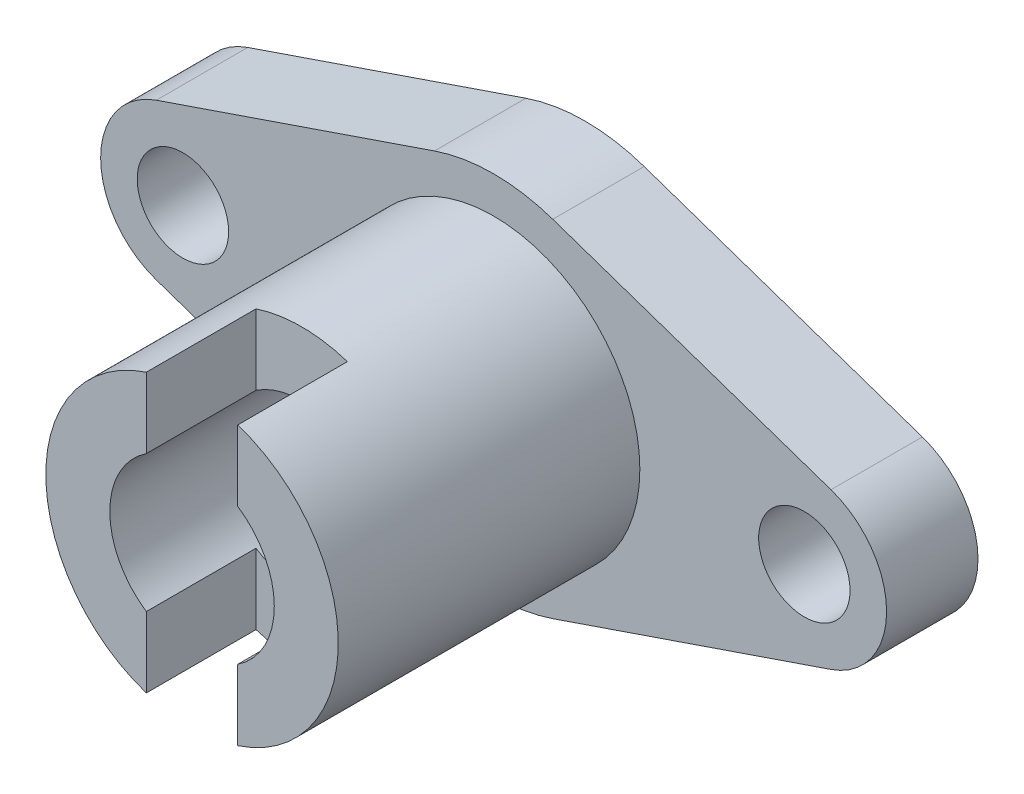
ISO-10303-21;
HEADER;
FILE_DESCRIPTION(('STEP AP214'),'2;1');
FILE_NAME('part.step','',(''),(''),'','','');
FILE_SCHEMA(('AUTOMOTIVE_DESIGN { 1 0 10303 214 1 1 1 1 }'));
ENDSEC;
DATA;
#1=APPLICATION_CONTEXT('core data for automotive mechanical design processes');
#2=APPLICATION_PROTOCOL_DEFINITION('international standard','automotive_design',2000,#1);
#3=PRODUCT_CONTEXT('',#1,'mechanical');
#4=PRODUCT('Part','Part','',(#3));
#5=PRODUCT_RELATED_PRODUCT_CATEGORY('part','',(#4));
#6=PRODUCT_DEFINITION_FORMATION('','',#4);
#7=PRODUCT_DEFINITION_CONTEXT('part definition',#1,'design');
#8=PRODUCT_DEFINITION('design','',#6,#7);
#9=PRODUCT_DEFINITION_SHAPE('','',#8);
#10=(LENGTH_UNIT() NAMED_UNIT(*) SI_UNIT(.MILLI.,.METRE.));
#11=(NAMED_UNIT(*) PLANE_ANGLE_UNIT() SI_UNIT($,.RADIAN.));
#12=(NAMED_UNIT(*) SI_UNIT($,.STERADIAN.) SOLID_ANGLE_UNIT());
#13=UNCERTAINTY_MEASURE_WITH_UNIT(LENGTH_MEASURE(1.E-05),#10,'distance_accuracy_value','');
#14=(GEOMETRIC_REPRESENTATION_CONTEXT(3) GLOBAL_UNCERTAINTY_ASSIGNED_CONTEXT((#13)) GLOBAL_UNIT_ASSIGNED_CONTEXT((#10,
#11,#12)) REPRESENTATION_CONTEXT('',''));
#15=CARTESIAN_POINT('',(0.,0.,0.));
#16=DIRECTION('',(0.,0.,1.));
#17=DIRECTION('',(1.,0.,0.));
#18=AXIS2_PLACEMENT_3D('',#15,#16,#17);
#19=CARTESIAN_POINT('',(0.,0.,43.));
#20=DIRECTION('',(0.,0.,-1.));
#21=DIRECTION('',(-1.,0.,0.));
#22=AXIS2_PLACEMENT_3D('',#19,#20,#21);
#23=CYLINDRICAL_SURFACE('',#22,16.);
#24=CARTESIAN_POINT('',(0.,0.,10.));
#25=DIRECTION('',(0.,0.,1.));
#26=DIRECTION('',(1.,0.,0.));
#27=AXIS2_PLACEMENT_3D('',#24,#25,#26);
#28=CIRCLE('',#27,16.);
#29=CARTESIAN_POINT('',(16.,0.,10.));
#30=VERTEX_POINT('',#29);
#31=EDGE_CURVE('E194',#30,#30,#28,.T.);
#32=ORIENTED_EDGE('',*,*,#31,.T.);
#33=EDGE_LOOP('',(#32));
#34=FACE_BOUND('',#33,.T.);
#35=DIRECTION('',(0.,0.,-1.));
#36=VECTOR('',#35,1.);
#37=CARTESIAN_POINT('',(-5.,15.1986841535707,43.));
#38=LINE('',#37,#36);
#39=CARTESIAN_POINT('',(-5.,15.1986841535707,31.));
#40=VERTEX_POINT('',#39);
#41=CARTESIAN_POINT('',(-5.,15.1986841535707,43.));
#42=VERTEX_POINT('',#41);
#43=EDGE_CURVE('E165',#40,#42,#38,.F.);
#44=ORIENTED_EDGE('',*,*,#43,.F.);
#45=CARTESIAN_POINT('',(0.,0.,31.));
#46=DIRECTION('',(0.,0.,1.));
#47=DIRECTION('',(1.,0.,0.));
#48=AXIS2_PLACEMENT_3D('',#45,#46,#47);
#49=CIRCLE('',#48,16.);
#50=CARTESIAN_POINT('',(5.,15.1986841535707,31.));
#51=VERTEX_POINT('',#50);
#52=EDGE_CURVE('E169',#51,#40,#49,.T.);
#53=ORIENTED_EDGE('',*,*,#52,.F.);
#54=DIRECTION('',(0.,0.,-1.));
#55=VECTOR('',#54,1.);
#56=CARTESIAN_POINT('',(5.,15.1986841535707,43.));
#57=LINE('',#56,#55);
#58=CARTESIAN_POINT('',(5.,15.1986841535707,43.));
#59=VERTEX_POINT('',#58);
#60=EDGE_CURVE('E154',#59,#51,#57,.T.);
#61=ORIENTED_EDGE('',*,*,#60,.F.);
#62=CARTESIAN_POINT('',(0.,0.,43.));
#63=DIRECTION('',(0.,0.,1.));
#64=DIRECTION('',(1.,0.,0.));
#65=AXIS2_PLACEMENT_3D('',#62,#63,#64);
#66=CIRCLE('',#65,16.);
#67=CARTESIAN_POINT('',(5.,-15.1986841535707,43.));
#68=VERTEX_POINT('',#67);
#69=EDGE_CURVE('E195',#68,#59,#66,.T.);
#70=ORIENTED_EDGE('',*,*,#69,.F.);
#71=DIRECTION('',(0.,0.,-1.));
#72=VECTOR('',#71,1.);
#73=CARTESIAN_POINT('',(5.,-15.1986841535707,43.));
#74=LINE('',#73,#72);
#75=CARTESIAN_POINT('',(5.,-15.1986841535707,31.));
#76=VERTEX_POINT('',#75);
#77=EDGE_CURVE('E166',#76,#68,#74,.F.);
#78=ORIENTED_EDGE('',*,*,#77,.F.);
#79=CARTESIAN_POINT('',(-5.,-15.1986841535707,31.));
#80=VERTEX_POINT('',#79);
#81=EDGE_CURVE('E176',#80,#76,#49,.T.);
#82=ORIENTED_EDGE('',*,*,#81,.F.);
#83=DIRECTION('',(0.,0.,-1.));
#84=VECTOR('',#83,1.);
#85=CARTESIAN_POINT('',(-5.,-15.1986841535707,43.));
#86=LINE('',#85,#84);
#87=CARTESIAN_POINT('',(-5.,-15.1986841535707,43.));
#88=VERTEX_POINT('',#87);
#89=EDGE_CURVE('E185',#88,#80,#86,.T.);
#90=ORIENTED_EDGE('',*,*,#89,.F.);
#91=EDGE_CURVE('E197',#42,#88,#66,.T.);
#92=ORIENTED_EDGE('',*,*,#91,.F.);
#93=EDGE_LOOP('',(#44,#53,#61,#70,#78,#82,#90,#92));
#94=FACE_BOUND('',#93,.T.);
#95=ADVANCED_FACE('F42',(#34,#94),#23,.T.);
#96=CARTESIAN_POINT('',(0.,0.,43.));
#97=DIRECTION('',(0.,0.,1.));
#98=DIRECTION('',(1.,0.,0.));
#99=AXIS2_PLACEMENT_3D('',#96,#97,#98);
#100=PLANE('',#99);
#101=ORIENTED_EDGE('',*,*,#91,.T.);
#102=DIRECTION('',(0.,-1.,0.));
#103=VECTOR('',#102,1.);
#104=CARTESIAN_POINT('',(-5.,89.,43.));
#105=LINE('',#104,#103);
#106=CARTESIAN_POINT('',(-5.,-7.48331477354788,43.));
#107=VERTEX_POINT('',#106);
#108=EDGE_CURVE('E181',#107,#88,#105,.T.);
#109=ORIENTED_EDGE('',*,*,#108,.F.);
#110=CARTESIAN_POINT('',(0.,0.,43.));
#111=DIRECTION('',(0.,0.,1.));
#112=DIRECTION('',(1.,0.,0.));
#113=AXIS2_PLACEMENT_3D('',#110,#111,#112);
#114=CIRCLE('',#113,9.);
#115=CARTESIAN_POINT('',(-5.,7.48331477354788,43.));
#116=VERTEX_POINT('',#115);
#117=EDGE_CURVE('E190',#116,#107,#114,.T.);
#118=ORIENTED_EDGE('',*,*,#117,.F.);
#119=EDGE_CURVE('E179',#42,#116,#105,.T.);
#120=ORIENTED_EDGE('',*,*,#119,.F.);
#121=EDGE_LOOP('',(#101,#109,#118,#120));
#122=FACE_BOUND('',#121,.T.);
#123=ADVANCED_FACE('F300',(#122),#100,.T.);
#124=ORIENTED_EDGE('',*,*,#69,.T.);
#125=DIRECTION('',(0.,-1.,0.));
#126=VECTOR('',#125,1.);
#127=CARTESIAN_POINT('',(5.,89.,43.));
#128=LINE('',#127,#126);
#129=CARTESIAN_POINT('',(5.,7.48331477354788,43.));
#130=VERTEX_POINT('',#129);
#131=EDGE_CURVE('E160',#59,#130,#128,.T.);
#132=ORIENTED_EDGE('',*,*,#131,.T.);
#133=CARTESIAN_POINT('',(5.,-7.48331477354788,43.));
#134=VERTEX_POINT('',#133);
#135=EDGE_CURVE('E187',#134,#130,#114,.T.);
#136=ORIENTED_EDGE('',*,*,#135,.F.);
#137=EDGE_CURVE('E172',#134,#68,#128,.T.);
#138=ORIENTED_EDGE('',*,*,#137,.T.);
#139=EDGE_LOOP('',(#124,#132,#136,#138));
#140=FACE_BOUND('',#139,.T.);
#141=ADVANCED_FACE('F306',(#140),#100,.T.);
#142=CARTESIAN_POINT('',(0.,0.,-46.));
#143=DIRECTION('',(0.,0.,1.));
#144=DIRECTION('',(1.,0.,0.));
#145=AXIS2_PLACEMENT_3D('',#142,#143,#144);
#146=CYLINDRICAL_SURFACE('',#145,9.);
#147=CARTESIAN_POINT('',(0.,0.,0.));
#148=DIRECTION('',(0.,0.,1.));
#149=DIRECTION('',(1.,0.,0.));
#150=AXIS2_PLACEMENT_3D('',#147,#148,#149);
#151=CIRCLE('',#150,9.);
#152=CARTESIAN_POINT('',(9.,0.,0.));
#153=VERTEX_POINT('',#152);
#154=EDGE_CURVE('E191',#153,#153,#151,.T.);
#155=ORIENTED_EDGE('',*,*,#154,.F.);
#156=EDGE_LOOP('',(#155));
#157=FACE_BOUND('',#156,.T.);
#158=DIRECTION('',(0.,0.,1.));
#159=VECTOR('',#158,1.);
#160=CARTESIAN_POINT('',(-5.00000000000001,-7.48331477354788,-46.));
#161=LINE('',#160,#159);
#162=CARTESIAN_POINT('',(-5.,-7.48331477354788,31.));
#163=VERTEX_POINT('',#162);
#164=EDGE_CURVE('E12',#163,#107,#161,.T.);
#165=ORIENTED_EDGE('',*,*,#164,.F.);
#166=CARTESIAN_POINT('',(0.,0.,31.));
#167=DIRECTION('',(0.,0.,1.));
#168=DIRECTION('',(1.,0.,0.));
#169=AXIS2_PLACEMENT_3D('',#166,#167,#168);
#170=CIRCLE('',#169,9.);
#171=CARTESIAN_POINT('',(5.,-7.48331477354788,31.));
#172=VERTEX_POINT('',#171);
#173=EDGE_CURVE('E275',#172,#163,#170,.F.);
#174=ORIENTED_EDGE('',*,*,#173,.F.);
#175=DIRECTION('',(0.,0.,1.));
#176=VECTOR('',#175,1.);
#177=CARTESIAN_POINT('',(5.,-7.48331477354788,-46.));
#178=LINE('',#177,#176);
#179=EDGE_CURVE('E50',#134,#172,#178,.F.);
#180=ORIENTED_EDGE('',*,*,#179,.F.);
#181=ORIENTED_EDGE('',*,*,#135,.T.);
#182=DIRECTION('',(0.,0.,1.));
#183=VECTOR('',#182,1.);
#184=CARTESIAN_POINT('',(5.,7.48331477354788,-46.));
#185=LINE('',#184,#183);
#186=CARTESIAN_POINT('',(5.,7.48331477354788,31.));
#187=VERTEX_POINT('',#186);
#188=EDGE_CURVE('E274',#187,#130,#185,.T.);
#189=ORIENTED_EDGE('',*,*,#188,.F.);
#190=CARTESIAN_POINT('',(-5.,7.48331477354788,31.));
#191=VERTEX_POINT('',#190);
#192=EDGE_CURVE('E171',#191,#187,#170,.F.);
#193=ORIENTED_EDGE('',*,*,#192,.F.);
#194=DIRECTION('',(0.,0.,1.));
#195=VECTOR('',#194,1.);
#196=CARTESIAN_POINT('',(-5.00000000000001,7.48331477354788,-46.));
#197=LINE('',#196,#195);
#198=EDGE_CURVE('E277',#116,#191,#197,.F.);
#199=ORIENTED_EDGE('',*,*,#198,.F.);
#200=ORIENTED_EDGE('',*,*,#117,.T.);
#201=EDGE_LOOP('',(#165,#174,#180,#181,#189,#193,#199,#200));
#202=FACE_BOUND('',#201,.T.);
#203=ADVANCED_FACE('F294',(#157,#202),#146,.F.);
#204=CARTESIAN_POINT('',(-34.,0.,10.));
#205=DIRECTION('',(0.,0.,-1.));
#206=DIRECTION('',(-1.,0.,0.));
#207=AXIS2_PLACEMENT_3D('',#204,#205,#206);
#208=CYLINDRICAL_SURFACE('',#207,9.00000000000001);
#209=CARTESIAN_POINT('',(-34.,0.,0.));
#210=DIRECTION('',(0.,0.,1.));
#211=DIRECTION('',(1.,0.,0.));
#212=AXIS2_PLACEMENT_3D('',#209,#210,#211);
#213=CIRCLE('',#212,9.00000000000001);
#214=CARTESIAN_POINT('',(-36.9117647058824,8.51596302819464,0.));
#215=VERTEX_POINT('',#214);
#216=CARTESIAN_POINT('',(-36.9117647058824,-8.51596302819464,0.));
#217=VERTEX_POINT('',#216);
#218=EDGE_CURVE('E203',#215,#217,#213,.T.);
#219=ORIENTED_EDGE('',*,*,#218,.T.);
#220=DIRECTION('',(0.,0.,-1.));
#221=VECTOR('',#220,1.);
#222=CARTESIAN_POINT('',(-36.9117647058824,-8.51596302819464,10.));
#223=LINE('',#222,#221);
#224=CARTESIAN_POINT('',(-36.9117647058824,-8.51596302819464,10.));
#225=VERTEX_POINT('',#224);
#226=EDGE_CURVE('E270',#225,#217,#223,.T.);
#227=ORIENTED_EDGE('',*,*,#226,.F.);
#228=CARTESIAN_POINT('',(-34.,0.,10.));
#229=DIRECTION('',(0.,0.,1.));
#230=DIRECTION('',(1.,0.,0.));
#231=AXIS2_PLACEMENT_3D('',#228,#229,#230);
#232=CIRCLE('',#231,9.00000000000001);
#233=CARTESIAN_POINT('',(-36.9117647058824,8.51596302819464,10.));
#234=VERTEX_POINT('',#233);
#235=EDGE_CURVE('E213',#234,#225,#232,.T.);
#236=ORIENTED_EDGE('',*,*,#235,.F.);
#237=DIRECTION('',(0.,0.,-1.));
#238=VECTOR('',#237,1.);
#239=CARTESIAN_POINT('',(-36.9117647058824,8.51596302819464,10.));
#240=LINE('',#239,#238);
#241=EDGE_CURVE('E234',#234,#215,#240,.T.);
#242=ORIENTED_EDGE('',*,*,#241,.T.);
#243=EDGE_LOOP('',(#219,#227,#236,#242));
#244=FACE_BOUND('',#243,.T.);
#245=ADVANCED_FACE('F44',(#244),#208,.T.);
#246=CARTESIAN_POINT('',(-36.9117647058824,-8.51596302819464,10.));
#247=DIRECTION('',(0.323529411764706,0.946218114243848,0.));
#248=DIRECTION('',(-0.946218114243848,0.323529411764706,0.));
#249=AXIS2_PLACEMENT_3D('',#246,#247,#248);
#250=PLANE('',#249);
#251=DIRECTION('',(0.946218114243848,-0.323529411764706,0.));
#252=VECTOR('',#251,1.);
#253=CARTESIAN_POINT('',(-36.9117647058824,-8.51596302819464,0.));
#254=LINE('',#253,#252);
#255=CARTESIAN_POINT('',(-6.47058823529412,-18.924362284877,0.));
#256=VERTEX_POINT('',#255);
#257=EDGE_CURVE('E237',#217,#256,#254,.T.);
#258=ORIENTED_EDGE('',*,*,#257,.T.);
#259=DIRECTION('',(0.,0.,-1.));
#260=VECTOR('',#259,1.);
#261=CARTESIAN_POINT('',(-6.47058823529412,-18.924362284877,10.));
#262=LINE('',#261,#260);
#263=CARTESIAN_POINT('',(-6.47058823529412,-18.924362284877,10.));
#264=VERTEX_POINT('',#263);
#265=EDGE_CURVE('E267',#264,#256,#262,.T.);
#266=ORIENTED_EDGE('',*,*,#265,.F.);
#267=DIRECTION('',(0.946218114243848,-0.323529411764706,0.));
#268=VECTOR('',#267,1.);
#269=CARTESIAN_POINT('',(-36.9117647058824,-8.51596302819464,10.));
#270=LINE('',#269,#268);
#271=EDGE_CURVE('E216',#225,#264,#270,.T.);
#272=ORIENTED_EDGE('',*,*,#271,.F.);
#273=ORIENTED_EDGE('',*,*,#226,.T.);
#274=EDGE_LOOP('',(#258,#266,#272,#273));
#275=FACE_BOUND('',#274,.T.);
#276=ADVANCED_FACE('F359',(#275),#250,.F.);
#277=CARTESIAN_POINT('',(0.,0.,10.));
#278=DIRECTION('',(0.,0.,-1.));
#279=DIRECTION('',(-1.,0.,0.));
#280=AXIS2_PLACEMENT_3D('',#277,#278,#279);
#281=CYLINDRICAL_SURFACE('',#280,20.);
#282=CARTESIAN_POINT('',(0.,0.,0.));
#283=DIRECTION('',(0.,0.,1.));
#284=DIRECTION('',(1.,0.,0.));
#285=AXIS2_PLACEMENT_3D('',#282,#283,#284);
#286=CIRCLE('',#285,20.);
#287=CARTESIAN_POINT('',(6.47058823529412,-18.924362284877,0.));
#288=VERTEX_POINT('',#287);
#289=EDGE_CURVE('E239',#256,#288,#286,.T.);
#290=ORIENTED_EDGE('',*,*,#289,.T.);
#291=DIRECTION('',(0.,0.,-1.));
#292=VECTOR('',#291,1.);
#293=CARTESIAN_POINT('',(6.47058823529412,-18.924362284877,10.));
#294=LINE('',#293,#292);
#295=CARTESIAN_POINT('',(6.47058823529412,-18.924362284877,10.));
#296=VERTEX_POINT('',#295);
#297=EDGE_CURVE('E265',#296,#288,#294,.T.);
#298=ORIENTED_EDGE('',*,*,#297,.F.);
#299=CARTESIAN_POINT('',(0.,0.,10.));
#300=DIRECTION('',(0.,0.,1.));
#301=DIRECTION('',(1.,0.,0.));
#302=AXIS2_PLACEMENT_3D('',#299,#300,#301);
#303=CIRCLE('',#302,20.);
#304=EDGE_CURVE('E219',#264,#296,#303,.T.);
#305=ORIENTED_EDGE('',*,*,#304,.F.);
#306=ORIENTED_EDGE('',*,*,#265,.T.);
#307=EDGE_LOOP('',(#290,#298,#305,#306));
#308=FACE_BOUND('',#307,.T.);
#309=ADVANCED_FACE('F356',(#308),#281,.T.);
#310=CARTESIAN_POINT('',(36.9117647058824,-8.51596302819464,10.));
#311=DIRECTION('',(0.323529411764706,-0.946218114243848,0.));
#312=DIRECTION('',(0.946218114243848,0.323529411764706,0.));
#313=AXIS2_PLACEMENT_3D('',#310,#311,#312);
#314=PLANE('',#313);
#315=DIRECTION('',(-0.946218114243848,-0.323529411764706,0.));
#316=VECTOR('',#315,1.);
#317=CARTESIAN_POINT('',(36.9117647058824,-8.51596302819464,0.));
#318=LINE('',#317,#316);
#319=CARTESIAN_POINT('',(36.9117647058824,-8.51596302819463,0.));
#320=VERTEX_POINT('',#319);
#321=EDGE_CURVE('E242',#320,#288,#318,.T.);
#322=ORIENTED_EDGE('',*,*,#321,.F.);
#323=DIRECTION('',(0.,0.,-1.));
#324=VECTOR('',#323,1.);
#325=CARTESIAN_POINT('',(36.9117647058824,-8.51596302819463,10.));
#326=LINE('',#325,#324);
#327=CARTESIAN_POINT('',(36.9117647058824,-8.51596302819463,10.));
#328=VERTEX_POINT('',#327);
#329=EDGE_CURVE('E263',#328,#320,#326,.T.);
#330=ORIENTED_EDGE('',*,*,#329,.F.);
#331=DIRECTION('',(-0.946218114243848,-0.323529411764706,0.));
#332=VECTOR('',#331,1.);
#333=CARTESIAN_POINT('',(36.9117647058824,-8.51596302819464,10.));
#334=LINE('',#333,#332);
#335=EDGE_CURVE('E221',#328,#296,#334,.T.);
#336=ORIENTED_EDGE('',*,*,#335,.T.);
#337=ORIENTED_EDGE('',*,*,#297,.T.);
#338=EDGE_LOOP('',(#322,#330,#336,#337));
#339=FACE_BOUND('',#338,.T.);
#340=ADVANCED_FACE('F352',(#339),#314,.T.);
#341=CARTESIAN_POINT('',(34.,0.,10.));
#342=DIRECTION('',(0.,0.,-1.));
#343=DIRECTION('',(-1.,0.,0.));
#344=AXIS2_PLACEMENT_3D('',#341,#342,#343);
#345=CYLINDRICAL_SURFACE('',#344,9.00000000000001);
#346=CARTESIAN_POINT('',(34.,0.,0.));
#347=DIRECTION('',(0.,0.,-1.));
#348=DIRECTION('',(-1.,0.,0.));
#349=AXIS2_PLACEMENT_3D('',#346,#347,#348);
#350=CIRCLE('',#349,9.00000000000001);
#351=CARTESIAN_POINT('',(36.9117647058824,8.51596302819464,0.));
#352=VERTEX_POINT('',#351);
#353=EDGE_CURVE('E245',#352,#320,#350,.T.);
#354=ORIENTED_EDGE('',*,*,#353,.F.);
#355=DIRECTION('',(0.,0.,-1.));
#356=VECTOR('',#355,1.);
#357=CARTESIAN_POINT('',(36.9117647058824,8.51596302819464,10.));
#358=LINE('',#357,#356);
#359=CARTESIAN_POINT('',(36.9117647058824,8.51596302819464,10.));
#360=VERTEX_POINT('',#359);
#361=EDGE_CURVE('E261',#360,#352,#358,.T.);
#362=ORIENTED_EDGE('',*,*,#361,.F.);
#363=CARTESIAN_POINT('',(34.,0.,10.));
#364=DIRECTION('',(0.,0.,-1.));
#365=DIRECTION('',(-1.,0.,0.));
#366=AXIS2_PLACEMENT_3D('',#363,#364,#365);
#367=CIRCLE('',#366,9.00000000000001);
#368=EDGE_CURVE('E224',#360,#328,#367,.T.);
#369=ORIENTED_EDGE('',*,*,#368,.T.);
#370=ORIENTED_EDGE('',*,*,#329,.T.);
#371=EDGE_LOOP('',(#354,#362,#369,#370));
#372=FACE_BOUND('',#371,.T.);
#373=ADVANCED_FACE('F348',(#372),#345,.T.);
#374=CARTESIAN_POINT('',(36.9117647058824,8.51596302819464,10.));
#375=DIRECTION('',(-0.323529411764706,-0.946218114243848,0.));
#376=DIRECTION('',(0.946218114243848,-0.323529411764706,0.));
#377=AXIS2_PLACEMENT_3D('',#374,#375,#376);
#378=PLANE('',#377);
#379=DIRECTION('',(-0.946218114243848,0.323529411764706,0.));
#380=VECTOR('',#379,1.);
#381=CARTESIAN_POINT('',(36.9117647058824,8.51596302819464,0.));
#382=LINE('',#381,#380);
#383=CARTESIAN_POINT('',(6.47058823529411,18.924362284877,0.));
#384=VERTEX_POINT('',#383);
#385=EDGE_CURVE('E248',#352,#384,#382,.T.);
#386=ORIENTED_EDGE('',*,*,#385,.T.);
#387=DIRECTION('',(0.,0.,-1.));
#388=VECTOR('',#387,1.);
#389=CARTESIAN_POINT('',(6.47058823529411,18.924362284877,10.));
#390=LINE('',#389,#388);
#391=CARTESIAN_POINT('',(6.47058823529411,18.924362284877,10.));
#392=VERTEX_POINT('',#391);
#393=EDGE_CURVE('E258',#392,#384,#390,.T.);
#394=ORIENTED_EDGE('',*,*,#393,.F.);
#395=DIRECTION('',(-0.946218114243848,0.323529411764706,0.));
#396=VECTOR('',#395,1.);
#397=CARTESIAN_POINT('',(36.9117647058824,8.51596302819464,10.));
#398=LINE('',#397,#396);
#399=EDGE_CURVE('E227',#360,#392,#398,.T.);
#400=ORIENTED_EDGE('',*,*,#399,.F.);
#401=ORIENTED_EDGE('',*,*,#361,.T.);
#402=EDGE_LOOP('',(#386,#394,#400,#401));
#403=FACE_BOUND('',#402,.T.);
#404=ADVANCED_FACE('F344',(#403),#378,.F.);
#405=CARTESIAN_POINT('',(0.,0.,10.));
#406=DIRECTION('',(0.,0.,-1.));
#407=DIRECTION('',(-1.,0.,0.));
#408=AXIS2_PLACEMENT_3D('',#405,#406,#407);
#409=CYLINDRICAL_SURFACE('',#408,20.);
#410=CARTESIAN_POINT('',(0.,0.,0.));
#411=DIRECTION('',(0.,0.,1.));
#412=DIRECTION('',(1.,0.,0.));
#413=AXIS2_PLACEMENT_3D('',#410,#411,#412);
#414=CIRCLE('',#413,20.);
#415=CARTESIAN_POINT('',(-6.47058823529411,18.924362284877,0.));
#416=VERTEX_POINT('',#415);
#417=EDGE_CURVE('E250',#384,#416,#414,.T.);
#418=ORIENTED_EDGE('',*,*,#417,.T.);
#419=DIRECTION('',(0.,0.,-1.));
#420=VECTOR('',#419,1.);
#421=CARTESIAN_POINT('',(-6.47058823529411,18.924362284877,10.));
#422=LINE('',#421,#420);
#423=CARTESIAN_POINT('',(-6.47058823529411,18.924362284877,10.));
#424=VERTEX_POINT('',#423);
#425=EDGE_CURVE('E256',#424,#416,#422,.T.);
#426=ORIENTED_EDGE('',*,*,#425,.F.);
#427=CARTESIAN_POINT('',(0.,0.,10.));
#428=DIRECTION('',(0.,0.,1.));
#429=DIRECTION('',(1.,0.,0.));
#430=AXIS2_PLACEMENT_3D('',#427,#428,#429);
#431=CIRCLE('',#430,20.);
#432=EDGE_CURVE('E229',#392,#424,#431,.T.);
#433=ORIENTED_EDGE('',*,*,#432,.F.);
#434=ORIENTED_EDGE('',*,*,#393,.T.);
#435=EDGE_LOOP('',(#418,#426,#433,#434));
#436=FACE_BOUND('',#435,.T.);
#437=ADVANCED_FACE('F340',(#436),#409,.T.);
#438=CARTESIAN_POINT('',(-36.9117647058824,8.51596302819464,10.));
#439=DIRECTION('',(-0.323529411764706,0.946218114243848,0.));
#440=DIRECTION('',(-0.946218114243848,-0.323529411764706,0.));
#441=AXIS2_PLACEMENT_3D('',#438,#439,#440);
#442=PLANE('',#441);
#443=DIRECTION('',(0.946218114243848,0.323529411764706,0.));
#444=VECTOR('',#443,1.);
#445=CARTESIAN_POINT('',(-36.9117647058824,8.51596302819464,0.));
#446=LINE('',#445,#444);
#447=EDGE_CURVE('E217',#215,#416,#446,.T.);
#448=ORIENTED_EDGE('',*,*,#447,.F.);
#449=ORIENTED_EDGE('',*,*,#241,.F.);
#450=DIRECTION('',(0.946218114243848,0.323529411764706,0.));
#451=VECTOR('',#450,1.);
#452=CARTESIAN_POINT('',(-36.9117647058824,8.51596302819464,10.));
#453=LINE('',#452,#451);
#454=EDGE_CURVE('E231',#234,#424,#453,.T.);
#455=ORIENTED_EDGE('',*,*,#454,.T.);
#456=ORIENTED_EDGE('',*,*,#425,.T.);
#457=EDGE_LOOP('',(#448,#449,#455,#456));
#458=FACE_BOUND('',#457,.T.);
#459=ADVANCED_FACE('F334',(#458),#442,.T.);
#460=CARTESIAN_POINT('',(-34.,0.,10.));
#461=DIRECTION('',(0.,0.,1.));
#462=DIRECTION('',(1.,0.,0.));
#463=AXIS2_PLACEMENT_3D('',#460,#461,#462);
#464=PLANE('',#463);
#465=ORIENTED_EDGE('',*,*,#31,.F.);
#466=EDGE_LOOP('',(#465));
#467=FACE_BOUND('',#466,.T.);
#468=CARTESIAN_POINT('',(-34.,0.,10.));
#469=DIRECTION('',(0.,0.,1.));
#470=DIRECTION('',(1.,0.,0.));
#471=AXIS2_PLACEMENT_3D('',#468,#469,#470);
#472=CIRCLE('',#471,5.);
#473=CARTESIAN_POINT('',(-29.,0.,10.));
#474=VERTEX_POINT('',#473);
#475=EDGE_CURVE('E200',#474,#474,#472,.T.);
#476=ORIENTED_EDGE('',*,*,#475,.F.);
#477=EDGE_LOOP('',(#476));
#478=FACE_BOUND('',#477,.T.);
#479=CARTESIAN_POINT('',(34.,0.,10.));
#480=DIRECTION('',(0.,0.,1.));
#481=DIRECTION('',(1.,0.,0.));
#482=AXIS2_PLACEMENT_3D('',#479,#480,#481);
#483=CIRCLE('',#482,5.);
#484=CARTESIAN_POINT('',(39.,0.,10.));
#485=VERTEX_POINT('',#484);
#486=EDGE_CURVE('E210',#485,#485,#483,.T.);
#487=ORIENTED_EDGE('',*,*,#486,.F.);
#488=EDGE_LOOP('',(#487));
#489=FACE_BOUND('',#488,.T.);
#490=ORIENTED_EDGE('',*,*,#235,.T.);
#491=ORIENTED_EDGE('',*,*,#271,.T.);
#492=ORIENTED_EDGE('',*,*,#304,.T.);
#493=ORIENTED_EDGE('',*,*,#335,.F.);
#494=ORIENTED_EDGE('',*,*,#368,.F.);
#495=ORIENTED_EDGE('',*,*,#399,.T.);
#496=ORIENTED_EDGE('',*,*,#432,.T.);
#497=ORIENTED_EDGE('',*,*,#454,.F.);
#498=EDGE_LOOP('',(#490,#491,#492,#493,#494,#495,#496,#497));
#499=FACE_BOUND('',#498,.T.);
#500=ADVANCED_FACE('F331',(#467,#478,#489,#499),#464,.T.);
#501=CARTESIAN_POINT('',(-34.,0.,0.));
#502=DIRECTION('',(0.,0.,1.));
#503=DIRECTION('',(1.,0.,0.));
#504=AXIS2_PLACEMENT_3D('',#501,#502,#503);
#505=PLANE('',#504);
#506=ORIENTED_EDGE('',*,*,#154,.T.);
#507=EDGE_LOOP('',(#506));
#508=FACE_BOUND('',#507,.T.);
#509=CARTESIAN_POINT('',(-34.,0.,0.));
#510=DIRECTION('',(0.,0.,1.));
#511=DIRECTION('',(1.,0.,0.));
#512=AXIS2_PLACEMENT_3D('',#509,#510,#511);
#513=CIRCLE('',#512,5.);
#514=CARTESIAN_POINT('',(-29.,0.,0.));
#515=VERTEX_POINT('',#514);
#516=EDGE_CURVE('E204',#515,#515,#513,.T.);
#517=ORIENTED_EDGE('',*,*,#516,.T.);
#518=EDGE_LOOP('',(#517));
#519=FACE_BOUND('',#518,.T.);
#520=CARTESIAN_POINT('',(34.,0.,0.));
#521=DIRECTION('',(0.,0.,1.));
#522=DIRECTION('',(1.,0.,0.));
#523=AXIS2_PLACEMENT_3D('',#520,#521,#522);
#524=CIRCLE('',#523,5.);
#525=CARTESIAN_POINT('',(39.,0.,0.));
#526=VERTEX_POINT('',#525);
#527=EDGE_CURVE('E207',#526,#526,#524,.T.);
#528=ORIENTED_EDGE('',*,*,#527,.T.);
#529=EDGE_LOOP('',(#528));
#530=FACE_BOUND('',#529,.T.);
#531=ORIENTED_EDGE('',*,*,#218,.F.);
#532=ORIENTED_EDGE('',*,*,#447,.T.);
#533=ORIENTED_EDGE('',*,*,#417,.F.);
#534=ORIENTED_EDGE('',*,*,#385,.F.);
#535=ORIENTED_EDGE('',*,*,#353,.T.);
#536=ORIENTED_EDGE('',*,*,#321,.T.);
#537=ORIENTED_EDGE('',*,*,#289,.F.);
#538=ORIENTED_EDGE('',*,*,#257,.F.);
#539=EDGE_LOOP('',(#531,#532,#533,#534,#535,#536,#537,#538));
#540=FACE_BOUND('',#539,.T.);
#541=ADVANCED_FACE('F329',(#508,#519,#530,#540),#505,.F.);
#542=CARTESIAN_POINT('',(34.,0.,10.));
#543=DIRECTION('',(0.,0.,-1.));
#544=DIRECTION('',(-1.,0.,0.));
#545=AXIS2_PLACEMENT_3D('',#542,#543,#544);
#546=CYLINDRICAL_SURFACE('',#545,5.);
#547=ORIENTED_EDGE('',*,*,#486,.T.);
#548=EDGE_LOOP('',(#547));
#549=FACE_BOUND('',#548,.T.);
#550=ORIENTED_EDGE('',*,*,#527,.F.);
#551=EDGE_LOOP('',(#550));
#552=FACE_BOUND('',#551,.T.);
#553=ADVANCED_FACE('F325',(#549,#552),#546,.F.);
#554=CARTESIAN_POINT('',(-34.,0.,10.));
#555=DIRECTION('',(0.,0.,-1.));
#556=DIRECTION('',(-1.,0.,0.));
#557=AXIS2_PLACEMENT_3D('',#554,#555,#556);
#558=CYLINDRICAL_SURFACE('',#557,5.);
#559=ORIENTED_EDGE('',*,*,#475,.T.);
#560=EDGE_LOOP('',(#559));
#561=FACE_BOUND('',#560,.T.);
#562=ORIENTED_EDGE('',*,*,#516,.F.);
#563=EDGE_LOOP('',(#562));
#564=FACE_BOUND('',#563,.T.);
#565=ADVANCED_FACE('F322',(#561,#564),#558,.F.);
#566=CARTESIAN_POINT('',(5.,89.,31.));
#567=DIRECTION('',(0.,0.,1.));
#568=DIRECTION('',(1.,0.,0.));
#569=AXIS2_PLACEMENT_3D('',#566,#567,#568);
#570=PLANE('',#569);
#571=ORIENTED_EDGE('',*,*,#52,.T.);
#572=DIRECTION('',(0.,-1.,0.));
#573=VECTOR('',#572,1.);
#574=CARTESIAN_POINT('',(-5.,89.,31.));
#575=LINE('',#574,#573);
#576=EDGE_CURVE('E65',#40,#191,#575,.T.);
#577=ORIENTED_EDGE('',*,*,#576,.T.);
#578=ORIENTED_EDGE('',*,*,#192,.T.);
#579=DIRECTION('',(0.,-1.,0.));
#580=VECTOR('',#579,1.);
#581=CARTESIAN_POINT('',(5.,89.,31.));
#582=LINE('',#581,#580);
#583=EDGE_CURVE('E157',#51,#187,#582,.T.);
#584=ORIENTED_EDGE('',*,*,#583,.F.);
#585=EDGE_LOOP('',(#571,#577,#578,#584));
#586=FACE_BOUND('',#585,.T.);
#587=ADVANCED_FACE('F168',(#586),#570,.T.);
#588=CARTESIAN_POINT('',(5.,89.,43.));
#589=DIRECTION('',(-1.,0.,0.));
#590=DIRECTION('',(0.,0.,1.));
#591=AXIS2_PLACEMENT_3D('',#588,#589,#590);
#592=PLANE('',#591);
#593=ORIENTED_EDGE('',*,*,#60,.T.);
#594=ORIENTED_EDGE('',*,*,#583,.T.);
#595=ORIENTED_EDGE('',*,*,#188,.T.);
#596=ORIENTED_EDGE('',*,*,#131,.F.);
#597=EDGE_LOOP('',(#593,#594,#595,#596));
#598=FACE_BOUND('',#597,.T.);
#599=ADVANCED_FACE('F156',(#598),#592,.T.);
#600=CARTESIAN_POINT('',(-5.,89.,43.));
#601=DIRECTION('',(1.,0.,0.));
#602=DIRECTION('',(0.,0.,-1.));
#603=AXIS2_PLACEMENT_3D('',#600,#601,#602);
#604=PLANE('',#603);
#605=ORIENTED_EDGE('',*,*,#43,.T.);
#606=ORIENTED_EDGE('',*,*,#119,.T.);
#607=ORIENTED_EDGE('',*,*,#198,.T.);
#608=ORIENTED_EDGE('',*,*,#576,.F.);
#609=EDGE_LOOP('',(#605,#606,#607,#608));
#610=FACE_BOUND('',#609,.T.);
#611=ADVANCED_FACE('F492',(#610),#604,.T.);
#612=ORIENTED_EDGE('',*,*,#89,.T.);
#613=EDGE_CURVE('E284',#163,#80,#575,.T.);
#614=ORIENTED_EDGE('',*,*,#613,.F.);
#615=ORIENTED_EDGE('',*,*,#164,.T.);
#616=ORIENTED_EDGE('',*,*,#108,.T.);
#617=EDGE_LOOP('',(#612,#614,#615,#616));
#618=FACE_BOUND('',#617,.T.);
#619=ADVANCED_FACE('F289',(#618),#604,.T.);
#620=ORIENTED_EDGE('',*,*,#77,.T.);
#621=ORIENTED_EDGE('',*,*,#137,.F.);
#622=ORIENTED_EDGE('',*,*,#179,.T.);
#623=EDGE_CURVE('E57',#172,#76,#582,.T.);
#624=ORIENTED_EDGE('',*,*,#623,.T.);
#625=EDGE_LOOP('',(#620,#621,#622,#624));
#626=FACE_BOUND('',#625,.T.);
#627=ADVANCED_FACE('F305',(#626),#592,.T.);
#628=ORIENTED_EDGE('',*,*,#81,.T.);
#629=ORIENTED_EDGE('',*,*,#623,.F.);
#630=ORIENTED_EDGE('',*,*,#173,.T.);
#631=ORIENTED_EDGE('',*,*,#613,.T.);
#632=EDGE_LOOP('',(#628,#629,#630,#631));
#633=FACE_BOUND('',#632,.T.);
#634=ADVANCED_FACE('F283',(#633),#570,.T.);
#635=CLOSED_SHELL('',(#95,#123,#141,#203,#245,#276,#309,#340,#373,#404,#437,#459,#500,#541,#553,
#565,#587,#599,#611,#619,#627,#634));
#636=MANIFOLD_SOLID_BREP('B2',#635);
#637=ADVANCED_BREP_SHAPE_REPRESENTATION('',(#18,#636),#14);
#638=SHAPE_DEFINITION_REPRESENTATION(#9,#637);
ENDSEC;
END-ISO-10303-21;
